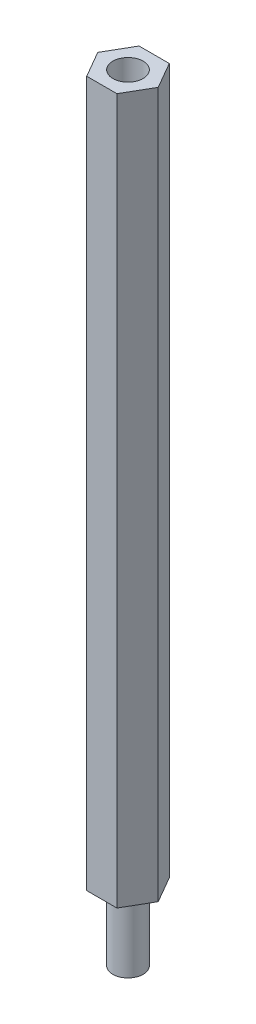
ISO-10303-21;
HEADER;
FILE_DESCRIPTION(('STEP AP214'),'2;1');
FILE_NAME('part.step','',(''),(''),'','','');
FILE_SCHEMA(('AUTOMOTIVE_DESIGN { 1 0 10303 214 1 1 1 1 }'));
ENDSEC;
DATA;
#1=APPLICATION_CONTEXT('core data for automotive mechanical design processes');
#2=APPLICATION_PROTOCOL_DEFINITION('international standard','automotive_design',2000,#1);
#3=PRODUCT_CONTEXT('',#1,'mechanical');
#4=PRODUCT('Part','Part','',(#3));
#5=PRODUCT_RELATED_PRODUCT_CATEGORY('part','',(#4));
#6=PRODUCT_DEFINITION_FORMATION('','',#4);
#7=PRODUCT_DEFINITION_CONTEXT('part definition',#1,'design');
#8=PRODUCT_DEFINITION('design','',#6,#7);
#9=PRODUCT_DEFINITION_SHAPE('','',#8);
#10=(LENGTH_UNIT() NAMED_UNIT(*) SI_UNIT(.MILLI.,.METRE.));
#11=(NAMED_UNIT(*) PLANE_ANGLE_UNIT() SI_UNIT($,.RADIAN.));
#12=(NAMED_UNIT(*) SI_UNIT($,.STERADIAN.) SOLID_ANGLE_UNIT());
#13=UNCERTAINTY_MEASURE_WITH_UNIT(LENGTH_MEASURE(1.E-05),#10,'distance_accuracy_value','');
#14=(GEOMETRIC_REPRESENTATION_CONTEXT(3) GLOBAL_UNCERTAINTY_ASSIGNED_CONTEXT((#13)) GLOBAL_UNIT_ASSIGNED_CONTEXT((#10,
#11,#12)) REPRESENTATION_CONTEXT('',''));
#15=CARTESIAN_POINT('',(0.,0.,0.));
#16=DIRECTION('',(0.,0.,1.));
#17=DIRECTION('',(1.,0.,0.));
#18=AXIS2_PLACEMENT_3D('',#15,#16,#17);
#19=CARTESIAN_POINT('',(1.5,70.,2.59807621135332));
#20=DIRECTION('',(-0.866025403784439,0.,-0.5));
#21=DIRECTION('',(-0.5,0.,0.866025403784439));
#22=AXIS2_PLACEMENT_3D('',#19,#20,#21);
#23=PLANE('',#22);
#24=DIRECTION('',(0.5,0.,-0.866025403784439));
#25=VECTOR('',#24,1.);
#26=CARTESIAN_POINT('',(1.5,0.,2.59807621135332));
#27=LINE('',#26,#25);
#28=CARTESIAN_POINT('',(1.5,0.,2.59807621135332));
#29=VERTEX_POINT('',#28);
#30=CARTESIAN_POINT('',(3.,0.,0.));
#31=VERTEX_POINT('',#30);
#32=EDGE_CURVE('E119',#29,#31,#27,.T.);
#33=ORIENTED_EDGE('',*,*,#32,.T.);
#34=DIRECTION('',(0.,-1.,0.));
#35=VECTOR('',#34,1.);
#36=CARTESIAN_POINT('',(3.,70.,0.));
#37=LINE('',#36,#35);
#38=CARTESIAN_POINT('',(3.,70.,0.));
#39=VERTEX_POINT('',#38);
#40=EDGE_CURVE('E36',#39,#31,#37,.T.);
#41=ORIENTED_EDGE('',*,*,#40,.F.);
#42=DIRECTION('',(0.5,0.,-0.866025403784439));
#43=VECTOR('',#42,1.);
#44=CARTESIAN_POINT('',(1.5,70.,2.59807621135332));
#45=LINE('',#44,#43);
#46=CARTESIAN_POINT('',(1.5,70.,2.59807621135332));
#47=VERTEX_POINT('',#46);
#48=EDGE_CURVE('E130',#47,#39,#45,.T.);
#49=ORIENTED_EDGE('',*,*,#48,.F.);
#50=DIRECTION('',(0.,-1.,0.));
#51=VECTOR('',#50,1.);
#52=CARTESIAN_POINT('',(1.5,70.,2.59807621135332));
#53=LINE('',#52,#51);
#54=EDGE_CURVE('E115',#47,#29,#53,.T.);
#55=ORIENTED_EDGE('',*,*,#54,.T.);
#56=EDGE_LOOP('',(#33,#41,#49,#55));
#57=FACE_BOUND('',#56,.T.);
#58=ADVANCED_FACE('F33',(#57),#23,.F.);
#59=CARTESIAN_POINT('',(3.,70.,0.));
#60=DIRECTION('',(-0.866025403784439,0.,0.5));
#61=DIRECTION('',(0.5,0.,0.866025403784439));
#62=AXIS2_PLACEMENT_3D('',#59,#60,#61);
#63=PLANE('',#62);
#64=DIRECTION('',(-0.5,0.,-0.866025403784439));
#65=VECTOR('',#64,1.);
#66=CARTESIAN_POINT('',(3.,0.,0.));
#67=LINE('',#66,#65);
#68=CARTESIAN_POINT('',(1.5,0.,-2.59807621135332));
#69=VERTEX_POINT('',#68);
#70=EDGE_CURVE('E122',#31,#69,#67,.T.);
#71=ORIENTED_EDGE('',*,*,#70,.T.);
#72=DIRECTION('',(0.,-1.,0.));
#73=VECTOR('',#72,1.);
#74=CARTESIAN_POINT('',(1.5,70.,-2.59807621135332));
#75=LINE('',#74,#73);
#76=CARTESIAN_POINT('',(1.5,70.,-2.59807621135332));
#77=VERTEX_POINT('',#76);
#78=EDGE_CURVE('E133',#77,#69,#75,.T.);
#79=ORIENTED_EDGE('',*,*,#78,.F.);
#80=DIRECTION('',(-0.5,0.,-0.866025403784439));
#81=VECTOR('',#80,1.);
#82=CARTESIAN_POINT('',(3.,70.,0.));
#83=LINE('',#82,#81);
#84=EDGE_CURVE('E88',#39,#77,#83,.T.);
#85=ORIENTED_EDGE('',*,*,#84,.F.);
#86=ORIENTED_EDGE('',*,*,#40,.T.);
#87=EDGE_LOOP('',(#71,#79,#85,#86));
#88=FACE_BOUND('',#87,.T.);
#89=ADVANCED_FACE('F138',(#88),#63,.F.);
#90=CARTESIAN_POINT('',(1.5,70.,-2.59807621135332));
#91=DIRECTION('',(0.,0.,1.));
#92=DIRECTION('',(1.,0.,0.));
#93=AXIS2_PLACEMENT_3D('',#90,#91,#92);
#94=PLANE('',#93);
#95=DIRECTION('',(-1.,0.,0.));
#96=VECTOR('',#95,1.);
#97=CARTESIAN_POINT('',(1.5,0.,-2.59807621135332));
#98=LINE('',#97,#96);
#99=CARTESIAN_POINT('',(-1.5,0.,-2.59807621135332));
#100=VERTEX_POINT('',#99);
#101=EDGE_CURVE('E125',#69,#100,#98,.T.);
#102=ORIENTED_EDGE('',*,*,#101,.T.);
#103=DIRECTION('',(0.,-1.,0.));
#104=VECTOR('',#103,1.);
#105=CARTESIAN_POINT('',(-1.5,70.,-2.59807621135332));
#106=LINE('',#105,#104);
#107=CARTESIAN_POINT('',(-1.5,70.,-2.59807621135332));
#108=VERTEX_POINT('',#107);
#109=EDGE_CURVE('E110',#108,#100,#106,.T.);
#110=ORIENTED_EDGE('',*,*,#109,.F.);
#111=DIRECTION('',(-1.,0.,0.));
#112=VECTOR('',#111,1.);
#113=CARTESIAN_POINT('',(1.5,70.,-2.59807621135332));
#114=LINE('',#113,#112);
#115=EDGE_CURVE('E101',#77,#108,#114,.T.);
#116=ORIENTED_EDGE('',*,*,#115,.F.);
#117=ORIENTED_EDGE('',*,*,#78,.T.);
#118=EDGE_LOOP('',(#102,#110,#116,#117));
#119=FACE_BOUND('',#118,.T.);
#120=ADVANCED_FACE('F144',(#119),#94,.F.);
#121=CARTESIAN_POINT('',(-1.5,70.,-2.59807621135332));
#122=DIRECTION('',(0.866025403784439,0.,0.5));
#123=DIRECTION('',(0.5,0.,-0.866025403784439));
#124=AXIS2_PLACEMENT_3D('',#121,#122,#123);
#125=PLANE('',#124);
#126=DIRECTION('',(-0.5,0.,0.866025403784439));
#127=VECTOR('',#126,1.);
#128=CARTESIAN_POINT('',(-1.5,0.,-2.59807621135332));
#129=LINE('',#128,#127);
#130=CARTESIAN_POINT('',(-3.,0.,0.));
#131=VERTEX_POINT('',#130);
#132=EDGE_CURVE('E109',#100,#131,#129,.T.);
#133=ORIENTED_EDGE('',*,*,#132,.T.);
#134=DIRECTION('',(0.,-1.,0.));
#135=VECTOR('',#134,1.);
#136=CARTESIAN_POINT('',(-3.,70.,0.));
#137=LINE('',#136,#135);
#138=CARTESIAN_POINT('',(-3.,70.,0.));
#139=VERTEX_POINT('',#138);
#140=EDGE_CURVE('E106',#139,#131,#137,.T.);
#141=ORIENTED_EDGE('',*,*,#140,.F.);
#142=DIRECTION('',(-0.5,0.,0.866025403784439));
#143=VECTOR('',#142,1.);
#144=CARTESIAN_POINT('',(-1.5,70.,-2.59807621135332));
#145=LINE('',#144,#143);
#146=EDGE_CURVE('E95',#108,#139,#145,.T.);
#147=ORIENTED_EDGE('',*,*,#146,.F.);
#148=ORIENTED_EDGE('',*,*,#109,.T.);
#149=EDGE_LOOP('',(#133,#141,#147,#148));
#150=FACE_BOUND('',#149,.T.);
#151=ADVANCED_FACE('F107',(#150),#125,.F.);
#152=CARTESIAN_POINT('',(-3.,70.,0.));
#153=DIRECTION('',(0.866025403784439,0.,-0.5));
#154=DIRECTION('',(-0.5,0.,-0.866025403784439));
#155=AXIS2_PLACEMENT_3D('',#152,#153,#154);
#156=PLANE('',#155);
#157=DIRECTION('',(0.5,0.,0.866025403784439));
#158=VECTOR('',#157,1.);
#159=CARTESIAN_POINT('',(-3.,0.,0.));
#160=LINE('',#159,#158);
#161=CARTESIAN_POINT('',(-1.5,0.,2.59807621135332));
#162=VERTEX_POINT('',#161);
#163=EDGE_CURVE('E73',#131,#162,#160,.T.);
#164=ORIENTED_EDGE('',*,*,#163,.T.);
#165=DIRECTION('',(0.,-1.,0.));
#166=VECTOR('',#165,1.);
#167=CARTESIAN_POINT('',(-1.5,70.,2.59807621135332));
#168=LINE('',#167,#166);
#169=CARTESIAN_POINT('',(-1.5,70.,2.59807621135332));
#170=VERTEX_POINT('',#169);
#171=EDGE_CURVE('E111',#170,#162,#168,.T.);
#172=ORIENTED_EDGE('',*,*,#171,.F.);
#173=DIRECTION('',(0.5,0.,0.866025403784439));
#174=VECTOR('',#173,1.);
#175=CARTESIAN_POINT('',(-3.,70.,0.));
#176=LINE('',#175,#174);
#177=EDGE_CURVE('E99',#139,#170,#176,.T.);
#178=ORIENTED_EDGE('',*,*,#177,.F.);
#179=ORIENTED_EDGE('',*,*,#140,.T.);
#180=EDGE_LOOP('',(#164,#172,#178,#179));
#181=FACE_BOUND('',#180,.T.);
#182=ADVANCED_FACE('F113',(#181),#156,.F.);
#183=CARTESIAN_POINT('',(-1.5,70.,2.59807621135332));
#184=DIRECTION('',(0.,0.,-1.));
#185=DIRECTION('',(-1.,0.,0.));
#186=AXIS2_PLACEMENT_3D('',#183,#184,#185);
#187=PLANE('',#186);
#188=DIRECTION('',(1.,0.,0.));
#189=VECTOR('',#188,1.);
#190=CARTESIAN_POINT('',(-1.5,0.,2.59807621135332));
#191=LINE('',#190,#189);
#192=EDGE_CURVE('E79',#162,#29,#191,.T.);
#193=ORIENTED_EDGE('',*,*,#192,.T.);
#194=ORIENTED_EDGE('',*,*,#54,.F.);
#195=DIRECTION('',(1.,0.,0.));
#196=VECTOR('',#195,1.);
#197=CARTESIAN_POINT('',(-1.5,70.,2.59807621135332));
#198=LINE('',#197,#196);
#199=EDGE_CURVE('E50',#170,#47,#198,.T.);
#200=ORIENTED_EDGE('',*,*,#199,.F.);
#201=ORIENTED_EDGE('',*,*,#171,.T.);
#202=EDGE_LOOP('',(#193,#194,#200,#201));
#203=FACE_BOUND('',#202,.T.);
#204=ADVANCED_FACE('F175',(#203),#187,.F.);
#205=CARTESIAN_POINT('',(0.,70.,0.));
#206=DIRECTION('',(0.,1.,0.));
#207=DIRECTION('',(0.,0.,1.));
#208=AXIS2_PLACEMENT_3D('',#205,#206,#207);
#209=PLANE('',#208);
#210=CARTESIAN_POINT('',(0.,70.,0.));
#211=DIRECTION('',(0.,1.,0.));
#212=DIRECTION('',(0.,0.,1.));
#213=AXIS2_PLACEMENT_3D('',#210,#211,#212);
#214=CIRCLE('',#213,1.5);
#215=CARTESIAN_POINT('',(0.,70.,1.5));
#216=VERTEX_POINT('',#215);
#217=EDGE_CURVE('E148',#216,#216,#214,.T.);
#218=ORIENTED_EDGE('',*,*,#217,.F.);
#219=EDGE_LOOP('',(#218));
#220=FACE_BOUND('',#219,.T.);
#221=ORIENTED_EDGE('',*,*,#48,.T.);
#222=ORIENTED_EDGE('',*,*,#84,.T.);
#223=ORIENTED_EDGE('',*,*,#115,.T.);
#224=ORIENTED_EDGE('',*,*,#146,.T.);
#225=ORIENTED_EDGE('',*,*,#177,.T.);
#226=ORIENTED_EDGE('',*,*,#199,.T.);
#227=EDGE_LOOP('',(#221,#222,#223,#224,#225,#226));
#228=FACE_BOUND('',#227,.T.);
#229=ADVANCED_FACE('F97',(#220,#228),#209,.T.);
#230=CARTESIAN_POINT('',(0.,0.,0.));
#231=DIRECTION('',(0.,1.,0.));
#232=DIRECTION('',(0.,0.,1.));
#233=AXIS2_PLACEMENT_3D('',#230,#231,#232);
#234=PLANE('',#233);
#235=CARTESIAN_POINT('',(0.,0.,0.));
#236=DIRECTION('',(0.,-1.,0.));
#237=DIRECTION('',(0.,0.,-1.));
#238=AXIS2_PLACEMENT_3D('',#235,#236,#237);
#239=CIRCLE('',#238,1.5);
#240=CARTESIAN_POINT('',(0.,0.,-1.5));
#241=VERTEX_POINT('',#240);
#242=EDGE_CURVE('E11',#241,#241,#239,.T.);
#243=ORIENTED_EDGE('',*,*,#242,.F.);
#244=EDGE_LOOP('',(#243));
#245=FACE_BOUND('',#244,.T.);
#246=ORIENTED_EDGE('',*,*,#32,.F.);
#247=ORIENTED_EDGE('',*,*,#192,.F.);
#248=ORIENTED_EDGE('',*,*,#163,.F.);
#249=ORIENTED_EDGE('',*,*,#132,.F.);
#250=ORIENTED_EDGE('',*,*,#101,.F.);
#251=ORIENTED_EDGE('',*,*,#70,.F.);
#252=EDGE_LOOP('',(#246,#247,#248,#249,#250,#251));
#253=FACE_BOUND('',#252,.T.);
#254=ADVANCED_FACE('F143',(#245,#253),#234,.F.);
#255=CARTESIAN_POINT('',(0.,50.,0.));
#256=DIRECTION('',(0.,1.,0.));
#257=DIRECTION('',(0.,0.,1.));
#258=AXIS2_PLACEMENT_3D('',#255,#256,#257);
#259=CYLINDRICAL_SURFACE('',#258,1.5);
#260=CARTESIAN_POINT('',(0.,50.,0.));
#261=DIRECTION('',(0.,1.,0.));
#262=DIRECTION('',(0.,0.,1.));
#263=AXIS2_PLACEMENT_3D('',#260,#261,#262);
#264=CIRCLE('',#263,1.5);
#265=CARTESIAN_POINT('',(0.,50.,1.5));
#266=VERTEX_POINT('',#265);
#267=EDGE_CURVE('E123',#266,#266,#264,.T.);
#268=ORIENTED_EDGE('',*,*,#267,.F.);
#269=EDGE_LOOP('',(#268));
#270=FACE_BOUND('',#269,.T.);
#271=ORIENTED_EDGE('',*,*,#217,.T.);
#272=EDGE_LOOP('',(#271));
#273=FACE_BOUND('',#272,.T.);
#274=ADVANCED_FACE('F167',(#270,#273),#259,.F.);
#275=CARTESIAN_POINT('',(0.,50.,0.));
#276=DIRECTION('',(0.,1.,0.));
#277=DIRECTION('',(0.,0.,1.));
#278=AXIS2_PLACEMENT_3D('',#275,#276,#277);
#279=PLANE('',#278);
#280=ORIENTED_EDGE('',*,*,#267,.T.);
#281=EDGE_LOOP('',(#280));
#282=FACE_BOUND('',#281,.T.);
#283=ADVANCED_FACE('F162',(#282),#279,.T.);
#284=CARTESIAN_POINT('',(0.,-7.,0.));
#285=DIRECTION('',(0.,1.,0.));
#286=DIRECTION('',(0.,0.,1.));
#287=AXIS2_PLACEMENT_3D('',#284,#285,#286);
#288=CYLINDRICAL_SURFACE('',#287,1.5);
#289=CARTESIAN_POINT('',(0.,-7.,0.));
#290=DIRECTION('',(0.,-1.,0.));
#291=DIRECTION('',(0.,0.,-1.));
#292=AXIS2_PLACEMENT_3D('',#289,#290,#291);
#293=CIRCLE('',#292,1.5);
#294=CARTESIAN_POINT('',(0.,-7.,-1.5));
#295=VERTEX_POINT('',#294);
#296=EDGE_CURVE('E151',#295,#295,#293,.T.);
#297=ORIENTED_EDGE('',*,*,#296,.F.);
#298=EDGE_LOOP('',(#297));
#299=FACE_BOUND('',#298,.T.);
#300=ORIENTED_EDGE('',*,*,#242,.T.);
#301=EDGE_LOOP('',(#300));
#302=FACE_BOUND('',#301,.T.);
#303=ADVANCED_FACE('F159',(#299,#302),#288,.T.);
#304=CARTESIAN_POINT('',(0.,-7.,0.));
#305=DIRECTION('',(0.,-1.,0.));
#306=DIRECTION('',(0.,0.,-1.));
#307=AXIS2_PLACEMENT_3D('',#304,#305,#306);
#308=PLANE('',#307);
#309=ORIENTED_EDGE('',*,*,#296,.T.);
#310=EDGE_LOOP('',(#309));
#311=FACE_BOUND('',#310,.T.);
#312=ADVANCED_FACE('F157',(#311),#308,.T.);
#313=CLOSED_SHELL('',(#58,#89,#120,#151,#182,#204,#229,#254,#274,#283,#303,#312));
#314=MANIFOLD_SOLID_BREP('B2',#313);
#315=ADVANCED_BREP_SHAPE_REPRESENTATION('',(#18,#314),#14);
#316=SHAPE_DEFINITION_REPRESENTATION(#9,#315);
ENDSEC;
END-ISO-10303-21;
